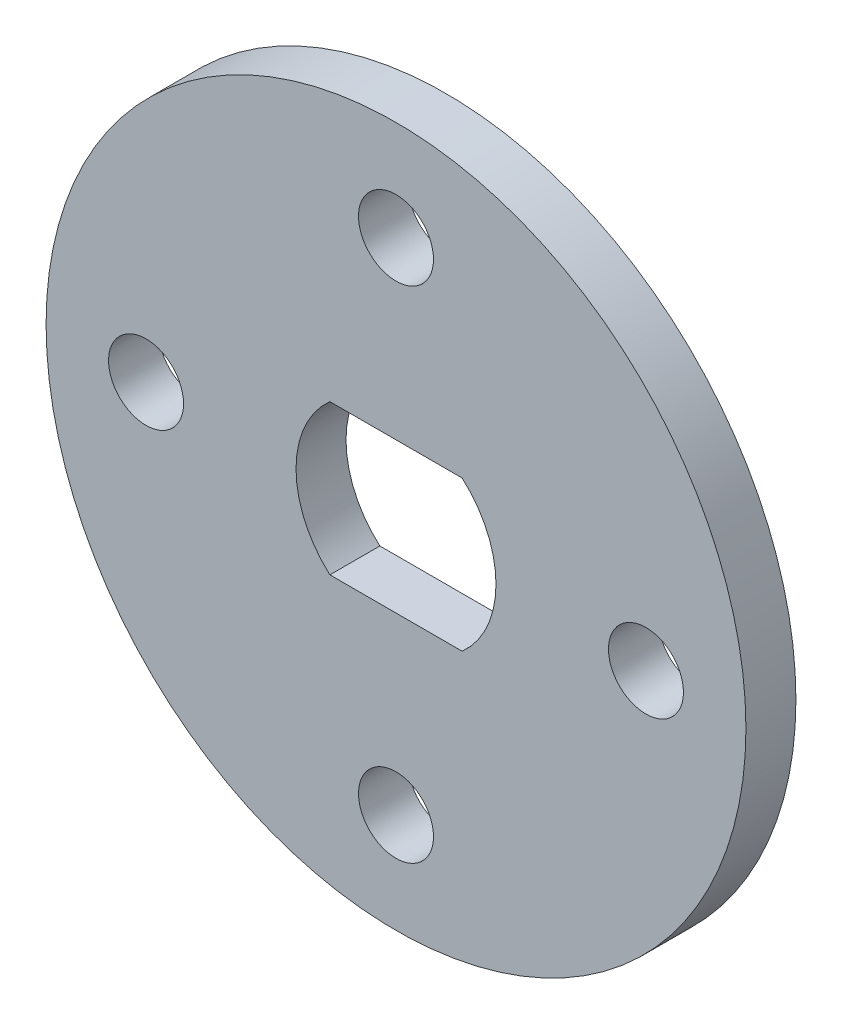
ISO-10303-21;
HEADER;
FILE_DESCRIPTION(('STEP AP214'),'2;1');
FILE_NAME('part.step','',(''),(''),'','','');
FILE_SCHEMA(('AUTOMOTIVE_DESIGN { 1 0 10303 214 1 1 1 1 }'));
ENDSEC;
DATA;
#1=APPLICATION_CONTEXT('core data for automotive mechanical design processes');
#2=APPLICATION_PROTOCOL_DEFINITION('international standard','automotive_design',2000,#1);
#3=PRODUCT_CONTEXT('',#1,'mechanical');
#4=PRODUCT('Part','Part','',(#3));
#5=PRODUCT_RELATED_PRODUCT_CATEGORY('part','',(#4));
#6=PRODUCT_DEFINITION_FORMATION('','',#4);
#7=PRODUCT_DEFINITION_CONTEXT('part definition',#1,'design');
#8=PRODUCT_DEFINITION('design','',#6,#7);
#9=PRODUCT_DEFINITION_SHAPE('','',#8);
#10=(LENGTH_UNIT() NAMED_UNIT(*) SI_UNIT(.MILLI.,.METRE.));
#11=(NAMED_UNIT(*) PLANE_ANGLE_UNIT() SI_UNIT($,.RADIAN.));
#12=(NAMED_UNIT(*) SI_UNIT($,.STERADIAN.) SOLID_ANGLE_UNIT());
#13=UNCERTAINTY_MEASURE_WITH_UNIT(LENGTH_MEASURE(1.E-05),#10,'distance_accuracy_value','');
#14=(GEOMETRIC_REPRESENTATION_CONTEXT(3) GLOBAL_UNCERTAINTY_ASSIGNED_CONTEXT((#13)) GLOBAL_UNIT_ASSIGNED_CONTEXT((#10,
#11,#12)) REPRESENTATION_CONTEXT('',''));
#15=CARTESIAN_POINT('',(0.,0.,0.));
#16=DIRECTION('',(0.,0.,1.));
#17=DIRECTION('',(1.,0.,0.));
#18=AXIS2_PLACEMENT_3D('',#15,#16,#17);
#19=CARTESIAN_POINT('',(0.,0.,2.));
#20=DIRECTION('',(0.,0.,1.));
#21=DIRECTION('',(1.,0.,0.));
#22=AXIS2_PLACEMENT_3D('',#19,#20,#21);
#23=PLANE('',#22);
#24=CARTESIAN_POINT('',(-10.,0.,2.));
#25=DIRECTION('',(0.,0.,1.));
#26=DIRECTION('',(1.,0.,0.));
#27=AXIS2_PLACEMENT_3D('',#24,#25,#26);
#28=CIRCLE('',#27,1.5);
#29=CARTESIAN_POINT('',(-8.5,0.,2.));
#30=VERTEX_POINT('',#29);
#31=EDGE_CURVE('E142',#30,#30,#28,.T.);
#32=ORIENTED_EDGE('',*,*,#31,.F.);
#33=EDGE_LOOP('',(#32));
#34=FACE_BOUND('',#33,.T.);
#35=CARTESIAN_POINT('',(0.,10.,2.));
#36=DIRECTION('',(0.,0.,1.));
#37=DIRECTION('',(1.,0.,0.));
#38=AXIS2_PLACEMENT_3D('',#35,#36,#37);
#39=CIRCLE('',#38,1.5);
#40=CARTESIAN_POINT('',(1.5,10.,2.));
#41=VERTEX_POINT('',#40);
#42=EDGE_CURVE('E158',#41,#41,#39,.T.);
#43=ORIENTED_EDGE('',*,*,#42,.F.);
#44=EDGE_LOOP('',(#43));
#45=FACE_BOUND('',#44,.T.);
#46=CARTESIAN_POINT('',(0.,0.,2.));
#47=DIRECTION('',(0.,0.,1.));
#48=DIRECTION('',(1.,0.,0.));
#49=AXIS2_PLACEMENT_3D('',#46,#47,#48);
#50=CIRCLE('',#49,14.);
#51=CARTESIAN_POINT('',(14.,0.,2.));
#52=VERTEX_POINT('',#51);
#53=EDGE_CURVE('E11',#52,#52,#50,.T.);
#54=ORIENTED_EDGE('',*,*,#53,.T.);
#55=EDGE_LOOP('',(#54));
#56=FACE_BOUND('',#55,.T.);
#57=CARTESIAN_POINT('',(10.,0.,2.));
#58=DIRECTION('',(0.,0.,1.));
#59=DIRECTION('',(1.,0.,0.));
#60=AXIS2_PLACEMENT_3D('',#57,#58,#59);
#61=CIRCLE('',#60,1.5);
#62=CARTESIAN_POINT('',(11.5,0.,2.));
#63=VERTEX_POINT('',#62);
#64=EDGE_CURVE('E150',#63,#63,#61,.T.);
#65=ORIENTED_EDGE('',*,*,#64,.F.);
#66=EDGE_LOOP('',(#65));
#67=FACE_BOUND('',#66,.T.);
#68=CARTESIAN_POINT('',(0.,-10.,2.));
#69=DIRECTION('',(0.,0.,1.));
#70=DIRECTION('',(1.,0.,0.));
#71=AXIS2_PLACEMENT_3D('',#68,#69,#70);
#72=CIRCLE('',#71,1.5);
#73=CARTESIAN_POINT('',(1.5,-10.,2.));
#74=VERTEX_POINT('',#73);
#75=EDGE_CURVE('E134',#74,#74,#72,.T.);
#76=ORIENTED_EDGE('',*,*,#75,.F.);
#77=EDGE_LOOP('',(#76));
#78=FACE_BOUND('',#77,.T.);
#79=DIRECTION('',(-1.,0.,0.));
#80=VECTOR('',#79,1.);
#81=CARTESIAN_POINT('',(0.,-3.,2.));
#82=LINE('',#81,#80);
#83=CARTESIAN_POINT('',(2.64575131106459,-3.,2.));
#84=VERTEX_POINT('',#83);
#85=CARTESIAN_POINT('',(-2.64575131106459,-3.,2.));
#86=VERTEX_POINT('',#85);
#87=EDGE_CURVE('E101',#84,#86,#82,.T.);
#88=ORIENTED_EDGE('',*,*,#87,.T.);
#89=CARTESIAN_POINT('',(0.,0.,2.));
#90=DIRECTION('',(0.,0.,-1.));
#91=DIRECTION('',(-1.,0.,0.));
#92=AXIS2_PLACEMENT_3D('',#89,#90,#91);
#93=CIRCLE('',#92,4.);
#94=CARTESIAN_POINT('',(-2.64575131106459,3.,2.));
#95=VERTEX_POINT('',#94);
#96=EDGE_CURVE('E96',#95,#86,#93,.F.);
#97=ORIENTED_EDGE('',*,*,#96,.F.);
#98=DIRECTION('',(-1.,0.,0.));
#99=VECTOR('',#98,1.);
#100=CARTESIAN_POINT('',(0.,3.,2.));
#101=LINE('',#100,#99);
#102=CARTESIAN_POINT('',(2.64575131106459,3.,2.));
#103=VERTEX_POINT('',#102);
#104=EDGE_CURVE('E87',#103,#95,#101,.T.);
#105=ORIENTED_EDGE('',*,*,#104,.F.);
#106=CARTESIAN_POINT('',(0.,0.,2.));
#107=DIRECTION('',(0.,0.,-1.));
#108=DIRECTION('',(-1.,0.,0.));
#109=AXIS2_PLACEMENT_3D('',#106,#107,#108);
#110=CIRCLE('',#109,4.);
#111=EDGE_CURVE('E61',#103,#84,#110,.T.);
#112=ORIENTED_EDGE('',*,*,#111,.T.);
#113=EDGE_LOOP('',(#88,#97,#105,#112));
#114=FACE_BOUND('',#113,.T.);
#115=ADVANCED_FACE('F45',(#34,#45,#56,#67,#78,#114),#23,.T.);
#116=CARTESIAN_POINT('',(0.,0.,0.));
#117=DIRECTION('',(0.,0.,1.));
#118=DIRECTION('',(1.,0.,0.));
#119=AXIS2_PLACEMENT_3D('',#116,#117,#118);
#120=PLANE('',#119);
#121=CARTESIAN_POINT('',(0.,-10.,0.));
#122=DIRECTION('',(0.,0.,1.));
#123=DIRECTION('',(1.,0.,0.));
#124=AXIS2_PLACEMENT_3D('',#121,#122,#123);
#125=CIRCLE('',#124,1.5);
#126=CARTESIAN_POINT('',(1.5,-10.,0.));
#127=VERTEX_POINT('',#126);
#128=EDGE_CURVE('E128',#127,#127,#125,.T.);
#129=ORIENTED_EDGE('',*,*,#128,.T.);
#130=EDGE_LOOP('',(#129));
#131=FACE_BOUND('',#130,.T.);
#132=CARTESIAN_POINT('',(-10.,0.,0.));
#133=DIRECTION('',(0.,0.,1.));
#134=DIRECTION('',(1.,0.,0.));
#135=AXIS2_PLACEMENT_3D('',#132,#133,#134);
#136=CIRCLE('',#135,1.5);
#137=CARTESIAN_POINT('',(-8.5,0.,0.));
#138=VERTEX_POINT('',#137);
#139=EDGE_CURVE('E138',#138,#138,#136,.T.);
#140=ORIENTED_EDGE('',*,*,#139,.T.);
#141=EDGE_LOOP('',(#140));
#142=FACE_BOUND('',#141,.T.);
#143=CARTESIAN_POINT('',(10.,0.,0.));
#144=DIRECTION('',(0.,0.,1.));
#145=DIRECTION('',(1.,0.,0.));
#146=AXIS2_PLACEMENT_3D('',#143,#144,#145);
#147=CIRCLE('',#146,1.5);
#148=CARTESIAN_POINT('',(11.5,0.,0.));
#149=VERTEX_POINT('',#148);
#150=EDGE_CURVE('E146',#149,#149,#147,.T.);
#151=ORIENTED_EDGE('',*,*,#150,.T.);
#152=EDGE_LOOP('',(#151));
#153=FACE_BOUND('',#152,.T.);
#154=CARTESIAN_POINT('',(0.,10.,0.));
#155=DIRECTION('',(0.,0.,1.));
#156=DIRECTION('',(1.,0.,0.));
#157=AXIS2_PLACEMENT_3D('',#154,#155,#156);
#158=CIRCLE('',#157,1.5);
#159=CARTESIAN_POINT('',(1.5,10.,0.));
#160=VERTEX_POINT('',#159);
#161=EDGE_CURVE('E154',#160,#160,#158,.T.);
#162=ORIENTED_EDGE('',*,*,#161,.T.);
#163=EDGE_LOOP('',(#162));
#164=FACE_BOUND('',#163,.T.);
#165=CARTESIAN_POINT('',(0.,0.,0.));
#166=DIRECTION('',(0.,0.,1.));
#167=DIRECTION('',(1.,0.,0.));
#168=AXIS2_PLACEMENT_3D('',#165,#166,#167);
#169=CIRCLE('',#168,14.);
#170=CARTESIAN_POINT('',(14.,0.,0.));
#171=VERTEX_POINT('',#170);
#172=EDGE_CURVE('E49',#171,#171,#169,.T.);
#173=ORIENTED_EDGE('',*,*,#172,.F.);
#174=EDGE_LOOP('',(#173));
#175=FACE_BOUND('',#174,.T.);
#176=CARTESIAN_POINT('',(0.,0.,0.));
#177=DIRECTION('',(0.,0.,-1.));
#178=DIRECTION('',(-1.,0.,0.));
#179=AXIS2_PLACEMENT_3D('',#176,#177,#178);
#180=CIRCLE('',#179,4.);
#181=CARTESIAN_POINT('',(-2.64575131106459,3.,0.));
#182=VERTEX_POINT('',#181);
#183=CARTESIAN_POINT('',(-2.64575131106459,-3.,0.));
#184=VERTEX_POINT('',#183);
#185=EDGE_CURVE('E69',#182,#184,#180,.F.);
#186=ORIENTED_EDGE('',*,*,#185,.T.);
#187=DIRECTION('',(-1.,0.,0.));
#188=VECTOR('',#187,1.);
#189=CARTESIAN_POINT('',(0.,-3.,0.));
#190=LINE('',#189,#188);
#191=CARTESIAN_POINT('',(2.64575131106459,-3.,0.));
#192=VERTEX_POINT('',#191);
#193=EDGE_CURVE('E106',#192,#184,#190,.T.);
#194=ORIENTED_EDGE('',*,*,#193,.F.);
#195=CARTESIAN_POINT('',(0.,0.,0.));
#196=DIRECTION('',(0.,0.,-1.));
#197=DIRECTION('',(-1.,0.,0.));
#198=AXIS2_PLACEMENT_3D('',#195,#196,#197);
#199=CIRCLE('',#198,4.);
#200=CARTESIAN_POINT('',(2.64575131106459,3.,0.));
#201=VERTEX_POINT('',#200);
#202=EDGE_CURVE('E110',#201,#192,#199,.T.);
#203=ORIENTED_EDGE('',*,*,#202,.F.);
#204=DIRECTION('',(-1.,0.,0.));
#205=VECTOR('',#204,1.);
#206=CARTESIAN_POINT('',(0.,3.,0.));
#207=LINE('',#206,#205);
#208=EDGE_CURVE('E119',#201,#182,#207,.T.);
#209=ORIENTED_EDGE('',*,*,#208,.T.);
#210=EDGE_LOOP('',(#186,#194,#203,#209));
#211=FACE_BOUND('',#210,.T.);
#212=ADVANCED_FACE('F166',(#131,#142,#153,#164,#175,#211),#120,.F.);
#213=CARTESIAN_POINT('',(0.,0.,2.));
#214=DIRECTION('',(0.,0.,-1.));
#215=DIRECTION('',(-1.,0.,0.));
#216=AXIS2_PLACEMENT_3D('',#213,#214,#215);
#217=CYLINDRICAL_SURFACE('',#216,14.);
#218=ORIENTED_EDGE('',*,*,#53,.F.);
#219=EDGE_LOOP('',(#218));
#220=FACE_BOUND('',#219,.T.);
#221=ORIENTED_EDGE('',*,*,#172,.T.);
#222=EDGE_LOOP('',(#221));
#223=FACE_BOUND('',#222,.T.);
#224=ADVANCED_FACE('F47',(#220,#223),#217,.T.);
#225=CARTESIAN_POINT('',(0.,10.,2.));
#226=DIRECTION('',(0.,0.,-1.));
#227=DIRECTION('',(-1.,0.,0.));
#228=AXIS2_PLACEMENT_3D('',#225,#226,#227);
#229=CYLINDRICAL_SURFACE('',#228,1.5);
#230=ORIENTED_EDGE('',*,*,#42,.T.);
#231=EDGE_LOOP('',(#230));
#232=FACE_BOUND('',#231,.T.);
#233=ORIENTED_EDGE('',*,*,#161,.F.);
#234=EDGE_LOOP('',(#233));
#235=FACE_BOUND('',#234,.T.);
#236=ADVANCED_FACE('F169',(#232,#235),#229,.F.);
#237=CARTESIAN_POINT('',(10.,0.,2.));
#238=DIRECTION('',(0.,0.,-1.));
#239=DIRECTION('',(-1.,0.,0.));
#240=AXIS2_PLACEMENT_3D('',#237,#238,#239);
#241=CYLINDRICAL_SURFACE('',#240,1.5);
#242=ORIENTED_EDGE('',*,*,#64,.T.);
#243=EDGE_LOOP('',(#242));
#244=FACE_BOUND('',#243,.T.);
#245=ORIENTED_EDGE('',*,*,#150,.F.);
#246=EDGE_LOOP('',(#245));
#247=FACE_BOUND('',#246,.T.);
#248=ADVANCED_FACE('F171',(#244,#247),#241,.F.);
#249=CARTESIAN_POINT('',(-10.,0.,2.));
#250=DIRECTION('',(0.,0.,-1.));
#251=DIRECTION('',(-1.,0.,0.));
#252=AXIS2_PLACEMENT_3D('',#249,#250,#251);
#253=CYLINDRICAL_SURFACE('',#252,1.5);
#254=ORIENTED_EDGE('',*,*,#31,.T.);
#255=EDGE_LOOP('',(#254));
#256=FACE_BOUND('',#255,.T.);
#257=ORIENTED_EDGE('',*,*,#139,.F.);
#258=EDGE_LOOP('',(#257));
#259=FACE_BOUND('',#258,.T.);
#260=ADVANCED_FACE('F178',(#256,#259),#253,.F.);
#261=CARTESIAN_POINT('',(0.,-10.,2.));
#262=DIRECTION('',(0.,0.,-1.));
#263=DIRECTION('',(-1.,0.,0.));
#264=AXIS2_PLACEMENT_3D('',#261,#262,#263);
#265=CYLINDRICAL_SURFACE('',#264,1.5);
#266=ORIENTED_EDGE('',*,*,#75,.T.);
#267=EDGE_LOOP('',(#266));
#268=FACE_BOUND('',#267,.T.);
#269=ORIENTED_EDGE('',*,*,#128,.F.);
#270=EDGE_LOOP('',(#269));
#271=FACE_BOUND('',#270,.T.);
#272=ADVANCED_FACE('F200',(#268,#271),#265,.F.);
#273=CARTESIAN_POINT('',(0.,0.,2.));
#274=DIRECTION('',(0.,0.,-1.));
#275=DIRECTION('',(-1.,0.,0.));
#276=AXIS2_PLACEMENT_3D('',#273,#274,#275);
#277=CYLINDRICAL_SURFACE('',#276,4.);
#278=ORIENTED_EDGE('',*,*,#185,.F.);
#279=DIRECTION('',(0.,0.,-1.));
#280=VECTOR('',#279,1.);
#281=CARTESIAN_POINT('',(-2.64575131106459,3.,2.));
#282=LINE('',#281,#280);
#283=EDGE_CURVE('E90',#95,#182,#282,.T.);
#284=ORIENTED_EDGE('',*,*,#283,.F.);
#285=ORIENTED_EDGE('',*,*,#96,.T.);
#286=DIRECTION('',(0.,0.,-1.));
#287=VECTOR('',#286,1.);
#288=CARTESIAN_POINT('',(-2.64575131106459,-3.,2.));
#289=LINE('',#288,#287);
#290=EDGE_CURVE('E125',#86,#184,#289,.T.);
#291=ORIENTED_EDGE('',*,*,#290,.T.);
#292=EDGE_LOOP('',(#278,#284,#285,#291));
#293=FACE_BOUND('',#292,.T.);
#294=ADVANCED_FACE('F98',(#293),#277,.F.);
#295=CARTESIAN_POINT('',(0.,-3.,2.));
#296=DIRECTION('',(0.,-1.,0.));
#297=DIRECTION('',(1.,0.,0.));
#298=AXIS2_PLACEMENT_3D('',#295,#296,#297);
#299=PLANE('',#298);
#300=ORIENTED_EDGE('',*,*,#193,.T.);
#301=ORIENTED_EDGE('',*,*,#290,.F.);
#302=ORIENTED_EDGE('',*,*,#87,.F.);
#303=DIRECTION('',(0.,0.,-1.));
#304=VECTOR('',#303,1.);
#305=CARTESIAN_POINT('',(2.64575131106459,-3.,2.));
#306=LINE('',#305,#304);
#307=EDGE_CURVE('E129',#84,#192,#306,.T.);
#308=ORIENTED_EDGE('',*,*,#307,.T.);
#309=EDGE_LOOP('',(#300,#301,#302,#308));
#310=FACE_BOUND('',#309,.T.);
#311=ADVANCED_FACE('F218',(#310),#299,.F.);
#312=CARTESIAN_POINT('',(0.,0.,2.));
#313=DIRECTION('',(0.,0.,-1.));
#314=DIRECTION('',(-1.,0.,0.));
#315=AXIS2_PLACEMENT_3D('',#312,#313,#314);
#316=CYLINDRICAL_SURFACE('',#315,4.);
#317=ORIENTED_EDGE('',*,*,#202,.T.);
#318=ORIENTED_EDGE('',*,*,#307,.F.);
#319=ORIENTED_EDGE('',*,*,#111,.F.);
#320=DIRECTION('',(0.,0.,-1.));
#321=VECTOR('',#320,1.);
#322=CARTESIAN_POINT('',(2.64575131106459,3.,2.));
#323=LINE('',#322,#321);
#324=EDGE_CURVE('E92',#103,#201,#323,.T.);
#325=ORIENTED_EDGE('',*,*,#324,.T.);
#326=EDGE_LOOP('',(#317,#318,#319,#325));
#327=FACE_BOUND('',#326,.T.);
#328=ADVANCED_FACE('F221',(#327),#316,.F.);
#329=CARTESIAN_POINT('',(0.,3.,2.));
#330=DIRECTION('',(0.,-1.,0.));
#331=DIRECTION('',(1.,0.,0.));
#332=AXIS2_PLACEMENT_3D('',#329,#330,#331);
#333=PLANE('',#332);
#334=ORIENTED_EDGE('',*,*,#208,.F.);
#335=ORIENTED_EDGE('',*,*,#324,.F.);
#336=ORIENTED_EDGE('',*,*,#104,.T.);
#337=ORIENTED_EDGE('',*,*,#283,.T.);
#338=EDGE_LOOP('',(#334,#335,#336,#337));
#339=FACE_BOUND('',#338,.T.);
#340=ADVANCED_FACE('F89',(#339),#333,.T.);
#341=CLOSED_SHELL('',(#115,#212,#224,#236,#248,#260,#272,#294,#311,#328,#340));
#342=MANIFOLD_SOLID_BREP('B2',#341);
#343=ADVANCED_BREP_SHAPE_REPRESENTATION('',(#18,#342),#14);
#344=SHAPE_DEFINITION_REPRESENTATION(#9,#343);
ENDSEC;
END-ISO-10303-21;
